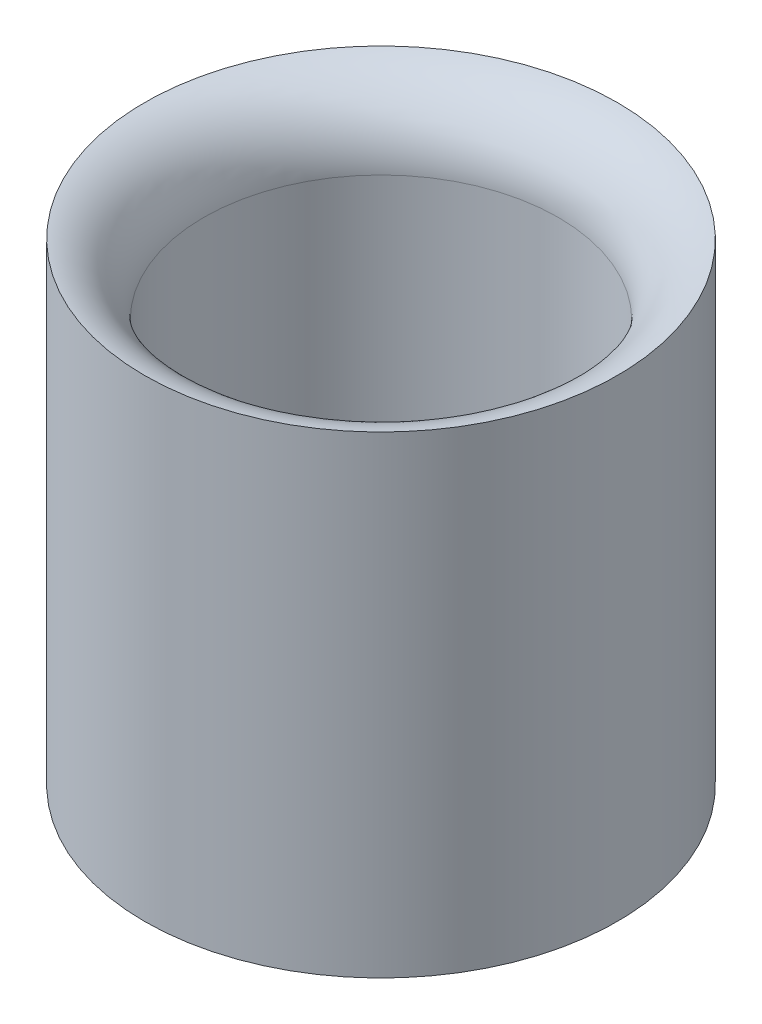
ISO-10303-21;
HEADER;
FILE_DESCRIPTION(('STEP AP214'),'2;1');
FILE_NAME('part.step','',(''),(''),'','','');
FILE_SCHEMA(('AUTOMOTIVE_DESIGN { 1 0 10303 214 1 1 1 1 }'));
ENDSEC;
DATA;
#1=APPLICATION_CONTEXT('core data for automotive mechanical design processes');
#2=APPLICATION_PROTOCOL_DEFINITION('international standard','automotive_design',2000,#1);
#3=PRODUCT_CONTEXT('',#1,'mechanical');
#4=PRODUCT('Part','Part','',(#3));
#5=PRODUCT_RELATED_PRODUCT_CATEGORY('part','',(#4));
#6=PRODUCT_DEFINITION_FORMATION('','',#4);
#7=PRODUCT_DEFINITION_CONTEXT('part definition',#1,'design');
#8=PRODUCT_DEFINITION('design','',#6,#7);
#9=PRODUCT_DEFINITION_SHAPE('','',#8);
#10=(LENGTH_UNIT() NAMED_UNIT(*) SI_UNIT(.MILLI.,.METRE.));
#11=(NAMED_UNIT(*) PLANE_ANGLE_UNIT() SI_UNIT($,.RADIAN.));
#12=(NAMED_UNIT(*) SI_UNIT($,.STERADIAN.) SOLID_ANGLE_UNIT());
#13=UNCERTAINTY_MEASURE_WITH_UNIT(LENGTH_MEASURE(1.E-05),#10,'distance_accuracy_value','');
#14=(GEOMETRIC_REPRESENTATION_CONTEXT(3) GLOBAL_UNCERTAINTY_ASSIGNED_CONTEXT((#13)) GLOBAL_UNIT_ASSIGNED_CONTEXT((#10,
#11,#12)) REPRESENTATION_CONTEXT('',''));
#15=CARTESIAN_POINT('',(0.,0.,0.));
#16=DIRECTION('',(0.,0.,1.));
#17=DIRECTION('',(1.,0.,0.));
#18=AXIS2_PLACEMENT_3D('',#15,#16,#17);
#19=CARTESIAN_POINT('',(0.,20.,0.));
#20=DIRECTION('',(0.,-1.,0.));
#21=DIRECTION('',(0.,0.,-1.));
#22=AXIS2_PLACEMENT_3D('',#19,#20,#21);
#23=CYLINDRICAL_SURFACE('',#22,10.);
#24=CARTESIAN_POINT('',(0.,20.,0.));
#25=DIRECTION('',(0.,1.,0.));
#26=DIRECTION('',(0.,0.,1.));
#27=AXIS2_PLACEMENT_3D('',#24,#25,#26);
#28=CIRCLE('',#27,10.);
#29=CARTESIAN_POINT('',(0.,20.,10.));
#30=VERTEX_POINT('',#29);
#31=EDGE_CURVE('E42',#30,#30,#28,.T.);
#32=ORIENTED_EDGE('',*,*,#31,.F.);
#33=EDGE_LOOP('',(#32));
#34=FACE_BOUND('',#33,.T.);
#35=CARTESIAN_POINT('',(0.,0.,0.));
#36=DIRECTION('',(0.,1.,0.));
#37=DIRECTION('',(0.,0.,1.));
#38=AXIS2_PLACEMENT_3D('',#35,#36,#37);
#39=CIRCLE('',#38,10.);
#40=CARTESIAN_POINT('',(0.,0.,10.));
#41=VERTEX_POINT('',#40);
#42=EDGE_CURVE('E48',#41,#41,#39,.T.);
#43=ORIENTED_EDGE('',*,*,#42,.T.);
#44=EDGE_LOOP('',(#43));
#45=FACE_BOUND('',#44,.T.);
#46=ADVANCED_FACE('F40',(#34,#45),#23,.T.);
#47=CARTESIAN_POINT('',(0.,0.,0.));
#48=DIRECTION('',(0.,1.,0.));
#49=DIRECTION('',(0.,0.,1.));
#50=AXIS2_PLACEMENT_3D('',#47,#48,#49);
#51=PLANE('',#50);
#52=CARTESIAN_POINT('',(0.,0.,0.));
#53=DIRECTION('',(0.,1.,0.));
#54=DIRECTION('',(0.,0.,1.));
#55=AXIS2_PLACEMENT_3D('',#52,#53,#54);
#56=CIRCLE('',#55,7.5);
#57=CARTESIAN_POINT('',(0.,0.,7.5));
#58=VERTEX_POINT('',#57);
#59=EDGE_CURVE('E52',#58,#58,#56,.F.);
#60=ORIENTED_EDGE('',*,*,#59,.F.);
#61=EDGE_LOOP('',(#60));
#62=FACE_BOUND('',#61,.T.);
#63=ORIENTED_EDGE('',*,*,#42,.F.);
#64=EDGE_LOOP('',(#63));
#65=FACE_BOUND('',#64,.T.);
#66=ADVANCED_FACE('F58',(#62,#65),#51,.F.);
#67=CARTESIAN_POINT('',(0.,-0.001000000000001,0.));
#68=DIRECTION('',(0.,1.,0.));
#69=DIRECTION('',(0.,0.,1.));
#70=AXIS2_PLACEMENT_3D('',#67,#68,#69);
#71=CYLINDRICAL_SURFACE('',#70,7.5);
#72=CARTESIAN_POINT('',(0.,17.0419601084502,0.));
#73=DIRECTION('',(0.,1.,0.));
#74=DIRECTION('',(0.,0.,1.));
#75=AXIS2_PLACEMENT_3D('',#72,#73,#74);
#76=CIRCLE('',#75,7.5);
#77=CARTESIAN_POINT('',(0.,17.0419601084502,7.5));
#78=VERTEX_POINT('',#77);
#79=EDGE_CURVE('E10',#78,#78,#76,.T.);
#80=ORIENTED_EDGE('',*,*,#79,.T.);
#81=EDGE_LOOP('',(#80));
#82=FACE_BOUND('',#81,.T.);
#83=ORIENTED_EDGE('',*,*,#59,.T.);
#84=EDGE_LOOP('',(#83));
#85=FACE_BOUND('',#84,.T.);
#86=ADVANCED_FACE('F59',(#82,#85),#71,.F.);
#87=CARTESIAN_POINT('',(0.,17.0419601084502,0.));
#88=DIRECTION('',(0.,1.,0.));
#89=DIRECTION('',(0.,0.,1.));
#90=AXIS2_PLACEMENT_3D('',#87,#88,#89);
#91=TOROIDAL_SURFACE('',#90,10.5,3.);
#92=ORIENTED_EDGE('',*,*,#31,.T.);
#93=EDGE_LOOP('',(#92));
#94=FACE_BOUND('',#93,.T.);
#95=ORIENTED_EDGE('',*,*,#79,.F.);
#96=EDGE_LOOP('',(#95));
#97=FACE_BOUND('',#96,.T.);
#98=ADVANCED_FACE('F39',(#94,#97),#91,.T.);
#99=CLOSED_SHELL('',(#46,#66,#86,#98));
#100=MANIFOLD_SOLID_BREP('B2',#99);
#101=ADVANCED_BREP_SHAPE_REPRESENTATION('',(#18,#100),#14);
#102=SHAPE_DEFINITION_REPRESENTATION(#9,#101);
ENDSEC;
END-ISO-10303-21;
